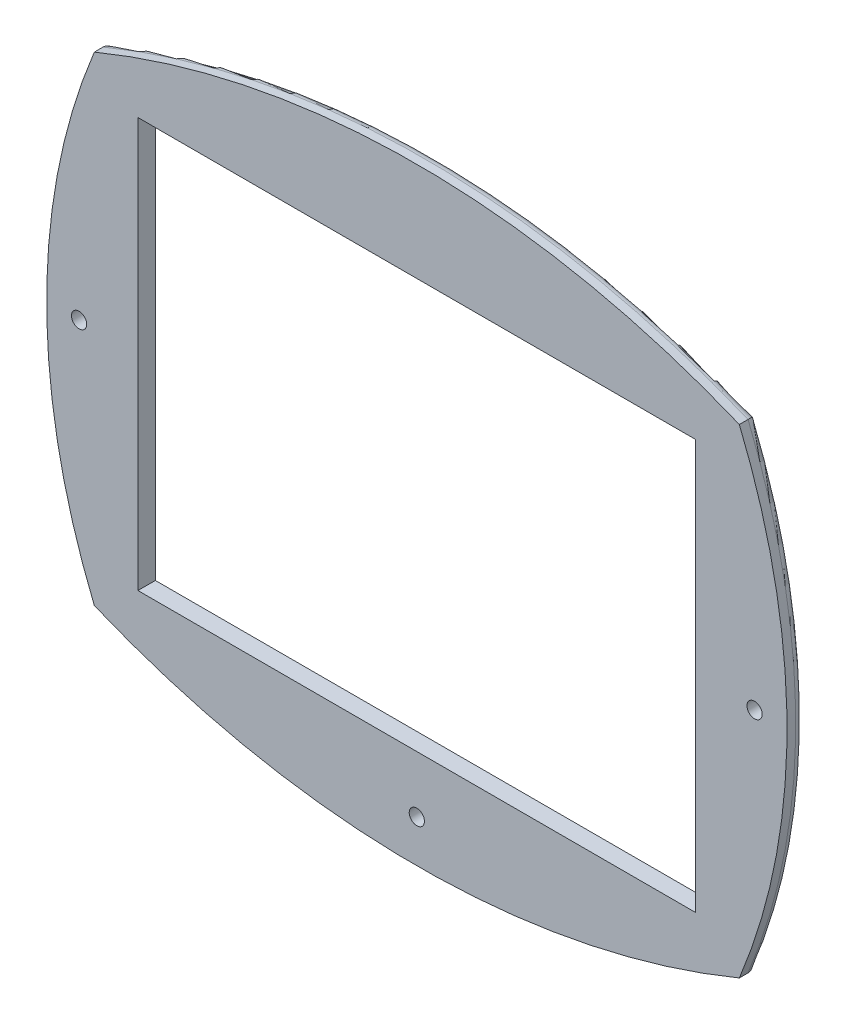
ISO-10303-21;
HEADER;
FILE_DESCRIPTION(('STEP AP214'),'2;1');
FILE_NAME('part.step','',(''),(''),'','','');
FILE_SCHEMA(('AUTOMOTIVE_DESIGN { 1 0 10303 214 1 1 1 1 }'));
ENDSEC;
DATA;
#1=APPLICATION_CONTEXT('core data for automotive mechanical design processes');
#2=APPLICATION_PROTOCOL_DEFINITION('international standard','automotive_design',2000,#1);
#3=PRODUCT_CONTEXT('',#1,'mechanical');
#4=PRODUCT('Part','Part','',(#3));
#5=PRODUCT_RELATED_PRODUCT_CATEGORY('part','',(#4));
#6=PRODUCT_DEFINITION_FORMATION('','',#4);
#7=PRODUCT_DEFINITION_CONTEXT('part definition',#1,'design');
#8=PRODUCT_DEFINITION('design','',#6,#7);
#9=PRODUCT_DEFINITION_SHAPE('','',#8);
#10=(LENGTH_UNIT() NAMED_UNIT(*) SI_UNIT(.MILLI.,.METRE.));
#11=(NAMED_UNIT(*) PLANE_ANGLE_UNIT() SI_UNIT($,.RADIAN.));
#12=(NAMED_UNIT(*) SI_UNIT($,.STERADIAN.) SOLID_ANGLE_UNIT());
#13=UNCERTAINTY_MEASURE_WITH_UNIT(LENGTH_MEASURE(1.E-05),#10,'distance_accuracy_value','');
#14=(GEOMETRIC_REPRESENTATION_CONTEXT(3) GLOBAL_UNCERTAINTY_ASSIGNED_CONTEXT((#13)) GLOBAL_UNIT_ASSIGNED_CONTEXT((#10,
#11,#12)) REPRESENTATION_CONTEXT('',''));
#15=CARTESIAN_POINT('',(0.,0.,0.));
#16=DIRECTION('',(0.,0.,1.));
#17=DIRECTION('',(1.,0.,0.));
#18=AXIS2_PLACEMENT_3D('',#15,#16,#17);
#19=CARTESIAN_POINT('',(-29.3908729652599,0.,2.));
#20=DIRECTION('',(0.,0.,-1.));
#21=DIRECTION('',(-1.,0.,0.));
#22=AXIS2_PLACEMENT_3D('',#19,#20,#21);
#23=CYLINDRICAL_SURFACE('',#22,71.8609630682005);
#24=DIRECTION('',(0.,0.,-1.));
#25=VECTOR('',#24,1.);
#26=CARTESIAN_POINT('',(36.9999999999999,-27.5,2.));
#27=LINE('',#26,#25);
#28=CARTESIAN_POINT('',(36.9999999999999,-27.5,2.));
#29=VERTEX_POINT('',#28);
#30=CARTESIAN_POINT('',(36.9999999999999,-27.5,1.));
#31=VERTEX_POINT('',#30);
#32=EDGE_CURVE('E143',#29,#31,#27,.T.);
#33=ORIENTED_EDGE('',*,*,#32,.T.);
#34=CARTESIAN_POINT('',(-29.3908729652599,0.,1.));
#35=DIRECTION('',(0.,0.,1.));
#36=DIRECTION('',(1.,0.,0.));
#37=AXIS2_PLACEMENT_3D('',#34,#35,#36);
#38=CIRCLE('',#37,71.8609630682005);
#39=CARTESIAN_POINT('',(37.,27.5,1.));
#40=VERTEX_POINT('',#39);
#41=EDGE_CURVE('E47',#31,#40,#38,.T.);
#42=ORIENTED_EDGE('',*,*,#41,.T.);
#43=DIRECTION('',(0.,0.,-1.));
#44=VECTOR('',#43,1.);
#45=CARTESIAN_POINT('',(37.,27.5,2.));
#46=LINE('',#45,#44);
#47=CARTESIAN_POINT('',(37.,27.5,2.));
#48=VERTEX_POINT('',#47);
#49=EDGE_CURVE('E155',#48,#40,#46,.T.);
#50=ORIENTED_EDGE('',*,*,#49,.F.);
#51=CARTESIAN_POINT('',(-29.3908729652599,0.,2.));
#52=DIRECTION('',(0.,0.,1.));
#53=DIRECTION('',(1.,0.,0.));
#54=AXIS2_PLACEMENT_3D('',#51,#52,#53);
#55=CIRCLE('',#54,71.8609630682005);
#56=EDGE_CURVE('E273',#48,#29,#55,.F.);
#57=ORIENTED_EDGE('',*,*,#56,.T.);
#58=EDGE_LOOP('',(#33,#42,#50,#57));
#59=FACE_BOUND('',#58,.T.);
#60=ADVANCED_FACE('F34',(#59),#23,.T.);
#61=CARTESIAN_POINT('',(0.,-61.8259018078043,2.));
#62=DIRECTION('',(0.,0.,-1.));
#63=DIRECTION('',(-1.,0.,0.));
#64=AXIS2_PLACEMENT_3D('',#61,#62,#63);
#65=CYLINDRICAL_SURFACE('',#64,96.6856594008517);
#66=ORIENTED_EDGE('',*,*,#49,.T.);
#67=CARTESIAN_POINT('',(0.,-61.8259018078043,1.));
#68=DIRECTION('',(0.,0.,1.));
#69=DIRECTION('',(1.,0.,0.));
#70=AXIS2_PLACEMENT_3D('',#67,#68,#69);
#71=CIRCLE('',#70,96.6856594008517);
#72=CARTESIAN_POINT('',(-37.,27.5,1.));
#73=VERTEX_POINT('',#72);
#74=EDGE_CURVE('E11',#40,#73,#71,.T.);
#75=ORIENTED_EDGE('',*,*,#74,.T.);
#76=DIRECTION('',(0.,0.,-1.));
#77=VECTOR('',#76,1.);
#78=CARTESIAN_POINT('',(-37.,27.5,2.));
#79=LINE('',#78,#77);
#80=CARTESIAN_POINT('',(-37.,27.5,2.));
#81=VERTEX_POINT('',#80);
#82=EDGE_CURVE('E294',#81,#73,#79,.T.);
#83=ORIENTED_EDGE('',*,*,#82,.F.);
#84=CARTESIAN_POINT('',(0.,-61.8259018078043,2.));
#85=DIRECTION('',(0.,0.,1.));
#86=DIRECTION('',(1.,0.,0.));
#87=AXIS2_PLACEMENT_3D('',#84,#85,#86);
#88=CIRCLE('',#87,96.6856594008517);
#89=EDGE_CURVE('E276',#81,#48,#88,.F.);
#90=ORIENTED_EDGE('',*,*,#89,.T.);
#91=EDGE_LOOP('',(#66,#75,#83,#90));
#92=FACE_BOUND('',#91,.T.);
#93=ADVANCED_FACE('F201',(#92),#65,.T.);
#94=CARTESIAN_POINT('',(29.3908729652599,0.,2.));
#95=DIRECTION('',(0.,0.,-1.));
#96=DIRECTION('',(-1.,0.,0.));
#97=AXIS2_PLACEMENT_3D('',#94,#95,#96);
#98=CYLINDRICAL_SURFACE('',#97,71.8609630682006);
#99=ORIENTED_EDGE('',*,*,#82,.T.);
#100=CARTESIAN_POINT('',(29.3908729652599,0.,1.));
#101=DIRECTION('',(0.,0.,1.));
#102=DIRECTION('',(1.,0.,0.));
#103=AXIS2_PLACEMENT_3D('',#100,#101,#102);
#104=CIRCLE('',#103,71.8609630682006);
#105=CARTESIAN_POINT('',(-37.,-27.5,1.));
#106=VERTEX_POINT('',#105);
#107=EDGE_CURVE('E151',#73,#106,#104,.T.);
#108=ORIENTED_EDGE('',*,*,#107,.T.);
#109=DIRECTION('',(0.,0.,-1.));
#110=VECTOR('',#109,1.);
#111=CARTESIAN_POINT('',(-37.,-27.5,2.));
#112=LINE('',#111,#110);
#113=CARTESIAN_POINT('',(-37.,-27.5,2.));
#114=VERTEX_POINT('',#113);
#115=EDGE_CURVE('E145',#114,#106,#112,.T.);
#116=ORIENTED_EDGE('',*,*,#115,.F.);
#117=CARTESIAN_POINT('',(29.3908729652599,0.,2.));
#118=DIRECTION('',(0.,0.,1.));
#119=DIRECTION('',(1.,0.,0.));
#120=AXIS2_PLACEMENT_3D('',#117,#118,#119);
#121=CIRCLE('',#120,71.8609630682006);
#122=EDGE_CURVE('E279',#81,#114,#121,.T.);
#123=ORIENTED_EDGE('',*,*,#122,.F.);
#124=EDGE_LOOP('',(#99,#108,#116,#123));
#125=FACE_BOUND('',#124,.T.);
#126=ADVANCED_FACE('F206',(#125),#98,.T.);
#127=CARTESIAN_POINT('',(0.,23.5,2.));
#128=DIRECTION('',(0.,1.,0.));
#129=DIRECTION('',(0.,0.,1.));
#130=AXIS2_PLACEMENT_3D('',#127,#128,#129);
#131=PLANE('',#130);
#132=DIRECTION('',(1.,0.,0.));
#133=VECTOR('',#132,1.);
#134=CARTESIAN_POINT('',(0.,23.5,0.));
#135=LINE('',#134,#133);
#136=CARTESIAN_POINT('',(-32.,23.5,0.));
#137=VERTEX_POINT('',#136);
#138=CARTESIAN_POINT('',(32.,23.5,0.));
#139=VERTEX_POINT('',#138);
#140=EDGE_CURVE('E142',#137,#139,#135,.T.);
#141=ORIENTED_EDGE('',*,*,#140,.T.);
#142=DIRECTION('',(0.,0.,-1.));
#143=VECTOR('',#142,1.);
#144=CARTESIAN_POINT('',(32.,23.5,2.));
#145=LINE('',#144,#143);
#146=CARTESIAN_POINT('',(32.,23.5,2.));
#147=VERTEX_POINT('',#146);
#148=EDGE_CURVE('E122',#147,#139,#145,.T.);
#149=ORIENTED_EDGE('',*,*,#148,.F.);
#150=DIRECTION('',(1.,0.,0.));
#151=VECTOR('',#150,1.);
#152=CARTESIAN_POINT('',(0.,23.5,2.));
#153=LINE('',#152,#151);
#154=CARTESIAN_POINT('',(-32.,23.5,2.));
#155=VERTEX_POINT('',#154);
#156=EDGE_CURVE('E129',#155,#147,#153,.T.);
#157=ORIENTED_EDGE('',*,*,#156,.F.);
#158=DIRECTION('',(0.,0.,-1.));
#159=VECTOR('',#158,1.);
#160=CARTESIAN_POINT('',(-32.,23.5,2.));
#161=LINE('',#160,#159);
#162=EDGE_CURVE('E284',#155,#137,#161,.T.);
#163=ORIENTED_EDGE('',*,*,#162,.T.);
#164=EDGE_LOOP('',(#141,#149,#157,#163));
#165=FACE_BOUND('',#164,.T.);
#166=ADVANCED_FACE('F140',(#165),#131,.F.);
#167=CARTESIAN_POINT('',(32.,0.,2.));
#168=DIRECTION('',(1.,0.,0.));
#169=DIRECTION('',(0.,1.,0.));
#170=AXIS2_PLACEMENT_3D('',#167,#168,#169);
#171=PLANE('',#170);
#172=DIRECTION('',(0.,-1.,0.));
#173=VECTOR('',#172,1.);
#174=CARTESIAN_POINT('',(32.,0.,0.));
#175=LINE('',#174,#173);
#176=CARTESIAN_POINT('',(32.,-23.5,0.));
#177=VERTEX_POINT('',#176);
#178=EDGE_CURVE('E286',#139,#177,#175,.T.);
#179=ORIENTED_EDGE('',*,*,#178,.T.);
#180=DIRECTION('',(0.,0.,-1.));
#181=VECTOR('',#180,1.);
#182=CARTESIAN_POINT('',(32.,-23.5,2.));
#183=LINE('',#182,#181);
#184=CARTESIAN_POINT('',(32.,-23.5,2.));
#185=VERTEX_POINT('',#184);
#186=EDGE_CURVE('E124',#185,#177,#183,.T.);
#187=ORIENTED_EDGE('',*,*,#186,.F.);
#188=DIRECTION('',(0.,-1.,0.));
#189=VECTOR('',#188,1.);
#190=CARTESIAN_POINT('',(32.,0.,2.));
#191=LINE('',#190,#189);
#192=EDGE_CURVE('E117',#147,#185,#191,.T.);
#193=ORIENTED_EDGE('',*,*,#192,.F.);
#194=ORIENTED_EDGE('',*,*,#148,.T.);
#195=EDGE_LOOP('',(#179,#187,#193,#194));
#196=FACE_BOUND('',#195,.T.);
#197=ADVANCED_FACE('F120',(#196),#171,.F.);
#198=CARTESIAN_POINT('',(0.,-23.5,2.));
#199=DIRECTION('',(0.,1.,0.));
#200=DIRECTION('',(0.,0.,1.));
#201=AXIS2_PLACEMENT_3D('',#198,#199,#200);
#202=PLANE('',#201);
#203=DIRECTION('',(1.,0.,0.));
#204=VECTOR('',#203,1.);
#205=CARTESIAN_POINT('',(0.,-23.5,0.));
#206=LINE('',#205,#204);
#207=CARTESIAN_POINT('',(-32.,-23.5,0.));
#208=VERTEX_POINT('',#207);
#209=EDGE_CURVE('E288',#208,#177,#206,.T.);
#210=ORIENTED_EDGE('',*,*,#209,.F.);
#211=DIRECTION('',(0.,0.,-1.));
#212=VECTOR('',#211,1.);
#213=CARTESIAN_POINT('',(-32.,-23.5,2.));
#214=LINE('',#213,#212);
#215=CARTESIAN_POINT('',(-32.,-23.5,2.));
#216=VERTEX_POINT('',#215);
#217=EDGE_CURVE('E147',#216,#208,#214,.T.);
#218=ORIENTED_EDGE('',*,*,#217,.F.);
#219=DIRECTION('',(1.,0.,0.));
#220=VECTOR('',#219,1.);
#221=CARTESIAN_POINT('',(0.,-23.5,2.));
#222=LINE('',#221,#220);
#223=EDGE_CURVE('E128',#216,#185,#222,.T.);
#224=ORIENTED_EDGE('',*,*,#223,.T.);
#225=ORIENTED_EDGE('',*,*,#186,.T.);
#226=EDGE_LOOP('',(#210,#218,#224,#225));
#227=FACE_BOUND('',#226,.T.);
#228=ADVANCED_FACE('F215',(#227),#202,.T.);
#229=CARTESIAN_POINT('',(-32.,0.,2.));
#230=DIRECTION('',(1.,0.,0.));
#231=DIRECTION('',(0.,1.,0.));
#232=AXIS2_PLACEMENT_3D('',#229,#230,#231);
#233=PLANE('',#232);
#234=DIRECTION('',(0.,-1.,0.));
#235=VECTOR('',#234,1.);
#236=CARTESIAN_POINT('',(-32.,0.,0.));
#237=LINE('',#236,#235);
#238=EDGE_CURVE('E138',#137,#208,#237,.T.);
#239=ORIENTED_EDGE('',*,*,#238,.F.);
#240=ORIENTED_EDGE('',*,*,#162,.F.);
#241=DIRECTION('',(0.,-1.,0.));
#242=VECTOR('',#241,1.);
#243=CARTESIAN_POINT('',(-32.,0.,2.));
#244=LINE('',#243,#242);
#245=EDGE_CURVE('E136',#155,#216,#244,.T.);
#246=ORIENTED_EDGE('',*,*,#245,.T.);
#247=ORIENTED_EDGE('',*,*,#217,.T.);
#248=EDGE_LOOP('',(#239,#240,#246,#247));
#249=FACE_BOUND('',#248,.T.);
#250=ADVANCED_FACE('F211',(#249),#233,.T.);
#251=CARTESIAN_POINT('',(0.,61.8259018078043,2.));
#252=DIRECTION('',(0.,0.,-1.));
#253=DIRECTION('',(-1.,0.,0.));
#254=AXIS2_PLACEMENT_3D('',#251,#252,#253);
#255=CYLINDRICAL_SURFACE('',#254,96.6856594008516);
#256=ORIENTED_EDGE('',*,*,#115,.T.);
#257=CARTESIAN_POINT('',(0.,61.8259018078043,1.));
#258=DIRECTION('',(0.,0.,1.));
#259=DIRECTION('',(1.,0.,0.));
#260=AXIS2_PLACEMENT_3D('',#257,#258,#259);
#261=CIRCLE('',#260,96.6856594008516);
#262=EDGE_CURVE('E62',#106,#31,#261,.T.);
#263=ORIENTED_EDGE('',*,*,#262,.T.);
#264=ORIENTED_EDGE('',*,*,#32,.F.);
#265=CARTESIAN_POINT('',(0.,61.8259018078043,2.));
#266=DIRECTION('',(0.,0.,1.));
#267=DIRECTION('',(1.,0.,0.));
#268=AXIS2_PLACEMENT_3D('',#265,#266,#267);
#269=CIRCLE('',#268,96.6856594008516);
#270=EDGE_CURVE('E282',#114,#29,#269,.T.);
#271=ORIENTED_EDGE('',*,*,#270,.F.);
#272=EDGE_LOOP('',(#256,#263,#264,#271));
#273=FACE_BOUND('',#272,.T.);
#274=ADVANCED_FACE('F214',(#273),#255,.T.);
#275=CARTESIAN_POINT('',(0.,0.,2.));
#276=DIRECTION('',(0.,0.,1.));
#277=DIRECTION('',(1.,0.,0.));
#278=AXIS2_PLACEMENT_3D('',#275,#276,#277);
#279=PLANE('',#278);
#280=CARTESIAN_POINT('',(-38.75,0.,2.));
#281=DIRECTION('',(0.,0.,-1.));
#282=DIRECTION('',(-1.,0.,0.));
#283=AXIS2_PLACEMENT_3D('',#280,#281,#282);
#284=CIRCLE('',#283,0.874999999999998);
#285=CARTESIAN_POINT('',(-39.625,0.,2.));
#286=VERTEX_POINT('',#285);
#287=EDGE_CURVE('E253',#286,#286,#284,.T.);
#288=ORIENTED_EDGE('',*,*,#287,.T.);
#289=EDGE_LOOP('',(#288));
#290=FACE_BOUND('',#289,.T.);
#291=CARTESIAN_POINT('',(0.,-30.,2.));
#292=DIRECTION('',(0.,0.,-1.));
#293=DIRECTION('',(-1.,0.,0.));
#294=AXIS2_PLACEMENT_3D('',#291,#292,#293);
#295=CIRCLE('',#294,0.875);
#296=CARTESIAN_POINT('',(-0.875,-30.,2.));
#297=VERTEX_POINT('',#296);
#298=EDGE_CURVE('E261',#297,#297,#295,.T.);
#299=ORIENTED_EDGE('',*,*,#298,.T.);
#300=EDGE_LOOP('',(#299));
#301=FACE_BOUND('',#300,.T.);
#302=CARTESIAN_POINT('',(38.75,0.,2.));
#303=DIRECTION('',(0.,0.,-1.));
#304=DIRECTION('',(-1.,0.,0.));
#305=AXIS2_PLACEMENT_3D('',#302,#303,#304);
#306=CIRCLE('',#305,0.874999999999998);
#307=CARTESIAN_POINT('',(37.875,0.,2.));
#308=VERTEX_POINT('',#307);
#309=EDGE_CURVE('E174',#308,#308,#306,.T.);
#310=ORIENTED_EDGE('',*,*,#309,.T.);
#311=EDGE_LOOP('',(#310));
#312=FACE_BOUND('',#311,.T.);
#313=ORIENTED_EDGE('',*,*,#156,.T.);
#314=ORIENTED_EDGE('',*,*,#192,.T.);
#315=ORIENTED_EDGE('',*,*,#223,.F.);
#316=ORIENTED_EDGE('',*,*,#245,.F.);
#317=EDGE_LOOP('',(#313,#314,#315,#316));
#318=FACE_BOUND('',#317,.T.);
#319=ORIENTED_EDGE('',*,*,#56,.F.);
#320=ORIENTED_EDGE('',*,*,#89,.F.);
#321=ORIENTED_EDGE('',*,*,#122,.T.);
#322=ORIENTED_EDGE('',*,*,#270,.T.);
#323=EDGE_LOOP('',(#319,#320,#321,#322));
#324=FACE_BOUND('',#323,.T.);
#325=ADVANCED_FACE('F133',(#290,#301,#312,#318,#324),#279,.T.);
#326=CARTESIAN_POINT('',(0.,0.,0.));
#327=DIRECTION('',(0.,0.,1.));
#328=DIRECTION('',(1.,0.,0.));
#329=AXIS2_PLACEMENT_3D('',#326,#327,#328);
#330=PLANE('',#329);
#331=CARTESIAN_POINT('',(-38.75,0.,0.));
#332=DIRECTION('',(0.,0.,-1.));
#333=DIRECTION('',(-1.,0.,0.));
#334=AXIS2_PLACEMENT_3D('',#331,#332,#333);
#335=CIRCLE('',#334,0.874999999999998);
#336=CARTESIAN_POINT('',(-39.625,0.,0.));
#337=VERTEX_POINT('',#336);
#338=EDGE_CURVE('E256',#337,#337,#335,.T.);
#339=ORIENTED_EDGE('',*,*,#338,.F.);
#340=EDGE_LOOP('',(#339));
#341=FACE_BOUND('',#340,.T.);
#342=CARTESIAN_POINT('',(0.,-30.,0.));
#343=DIRECTION('',(0.,0.,-1.));
#344=DIRECTION('',(-1.,0.,0.));
#345=AXIS2_PLACEMENT_3D('',#342,#343,#344);
#346=CIRCLE('',#345,0.875);
#347=CARTESIAN_POINT('',(-0.875,-30.,0.));
#348=VERTEX_POINT('',#347);
#349=EDGE_CURVE('E258',#348,#348,#346,.T.);
#350=ORIENTED_EDGE('',*,*,#349,.F.);
#351=EDGE_LOOP('',(#350));
#352=FACE_BOUND('',#351,.T.);
#353=CARTESIAN_POINT('',(38.75,0.,0.));
#354=DIRECTION('',(0.,0.,-1.));
#355=DIRECTION('',(-1.,0.,0.));
#356=AXIS2_PLACEMENT_3D('',#353,#354,#355);
#357=CIRCLE('',#356,0.874999999999998);
#358=CARTESIAN_POINT('',(37.875,0.,0.));
#359=VERTEX_POINT('',#358);
#360=EDGE_CURVE('E264',#359,#359,#357,.T.);
#361=ORIENTED_EDGE('',*,*,#360,.F.);
#362=EDGE_LOOP('',(#361));
#363=FACE_BOUND('',#362,.T.);
#364=CARTESIAN_POINT('',(0.,61.8259018078043,0.));
#365=DIRECTION('',(0.,0.,1.));
#366=DIRECTION('',(1.,0.,0.));
#367=AXIS2_PLACEMENT_3D('',#364,#365,#366);
#368=CIRCLE('',#367,95.6856594008516);
#369=CARTESIAN_POINT('',(36.2335379982626,-26.7341125276973,0.));
#370=VERTEX_POINT('',#369);
#371=CARTESIAN_POINT('',(-36.2335379982627,-26.7341125276973,0.));
#372=VERTEX_POINT('',#371);
#373=EDGE_CURVE('E159',#370,#372,#368,.F.);
#374=ORIENTED_EDGE('',*,*,#373,.T.);
#375=CARTESIAN_POINT('',(29.3908729652599,0.,0.));
#376=DIRECTION('',(0.,0.,1.));
#377=DIRECTION('',(1.,0.,0.));
#378=AXIS2_PLACEMENT_3D('',#375,#376,#377);
#379=CIRCLE('',#378,70.8609630682006);
#380=CARTESIAN_POINT('',(-36.2335379982626,26.7341125276973,0.));
#381=VERTEX_POINT('',#380);
#382=EDGE_CURVE('E161',#372,#381,#379,.F.);
#383=ORIENTED_EDGE('',*,*,#382,.T.);
#384=CARTESIAN_POINT('',(0.,-61.8259018078043,0.));
#385=DIRECTION('',(0.,0.,1.));
#386=DIRECTION('',(1.,0.,0.));
#387=AXIS2_PLACEMENT_3D('',#384,#385,#386);
#388=CIRCLE('',#387,95.6856594008517);
#389=CARTESIAN_POINT('',(36.2335379982626,26.7341125276973,0.));
#390=VERTEX_POINT('',#389);
#391=EDGE_CURVE('E154',#381,#390,#388,.F.);
#392=ORIENTED_EDGE('',*,*,#391,.T.);
#393=CARTESIAN_POINT('',(-29.3908729652599,0.,0.));
#394=DIRECTION('',(0.,0.,1.));
#395=DIRECTION('',(1.,0.,0.));
#396=AXIS2_PLACEMENT_3D('',#393,#394,#395);
#397=CIRCLE('',#396,70.8609630682005);
#398=EDGE_CURVE('E157',#390,#370,#397,.F.);
#399=ORIENTED_EDGE('',*,*,#398,.T.);
#400=EDGE_LOOP('',(#374,#383,#392,#399));
#401=FACE_BOUND('',#400,.T.);
#402=ORIENTED_EDGE('',*,*,#140,.F.);
#403=ORIENTED_EDGE('',*,*,#238,.T.);
#404=ORIENTED_EDGE('',*,*,#209,.T.);
#405=ORIENTED_EDGE('',*,*,#178,.F.);
#406=EDGE_LOOP('',(#402,#403,#404,#405));
#407=FACE_BOUND('',#406,.T.);
#408=ADVANCED_FACE('F197',(#341,#352,#363,#401,#407),#330,.F.);
#409=CARTESIAN_POINT('',(-29.3908729652599,0.,1.));
#410=DIRECTION('',(0.,0.,1.));
#411=DIRECTION('',(1.,0.,0.));
#412=AXIS2_PLACEMENT_3D('',#409,#410,#411);
#413=TOROIDAL_SURFACE('',#412,70.8609630682005,1.);
#414=CARTESIAN_POINT('',(36.9999999999999,-27.5,1.));
#415=CARTESIAN_POINT('',(37.0000006454729,-27.5000006517377,0.9734140534353));
#416=CARTESIAN_POINT('',(36.9991879715394,-27.4991879709086,0.946841431281818));
#417=CARTESIAN_POINT('',(36.9959511433835,-27.4959511554365,0.89389852892022));
#418=CARTESIAN_POINT('',(36.9935273146641,-27.4935273462913,0.867528208929138));
#419=CARTESIAN_POINT('',(36.9838846586652,-27.4838848674329,0.789157604832926));
#420=CARTESIAN_POINT('',(36.9742944073282,-27.4742948913634,0.737702750726048));
#421=CARTESIAN_POINT('',(36.9491737207126,-27.4491760697353,0.637838057785487));
#422=CARTESIAN_POINT('',(36.9336448629545,-27.4336488013482,0.589427414266572));
#423=CARTESIAN_POINT('',(36.8972250142863,-27.3972349214859,0.49680995740899));
#424=CARTESIAN_POINT('',(36.8763320213308,-27.3763463090078,0.452604722107335));
#425=CARTESIAN_POINT('',(36.829173576208,-27.3292013058199,0.368109779698057));
#426=CARTESIAN_POINT('',(36.8027616582633,-27.302798590231,0.327983931453884));
#427=CARTESIAN_POINT('',(36.7458320880646,-27.2458939930585,0.254054363943943));
#428=CARTESIAN_POINT('',(36.7153131292371,-27.2153908069952,0.220252664793814));
#429=CARTESIAN_POINT('',(36.6487024678975,-27.1488212483041,0.157341582201635));
#430=CARTESIAN_POINT('',(36.6123675196812,-27.1125122376759,0.128747055956251));
#431=CARTESIAN_POINT('',(36.5369768041409,-27.0371841223175,0.0799144107795119));
#432=CARTESIAN_POINT('',(36.4979200433044,-26.9981640280067,0.05967936208369));
#433=CARTESIAN_POINT('',(36.4223677164697,-26.9226918435645,0.0295346193055102));
#434=CARTESIAN_POINT('',(36.3860437753347,-26.8864102336682,0.0187533263601759));
#435=CARTESIAN_POINT('',(36.312747856409,-26.8132078911422,0.00417115700707229));
#436=CARTESIAN_POINT('',(36.2757773344348,-26.7762885961664,0.000356236665000513));
#437=CARTESIAN_POINT('',(36.2370682791797,-26.7376374949193,7.91473840324419E-06));
#438=CARTESIAN_POINT('',(36.2353030871475,-26.7358749550942,-1.88588959210333E-08));
#439=CARTESIAN_POINT('',(36.2335379982626,-26.7341125276973,0.));
#440=B_SPLINE_CURVE_WITH_KNOTS('',3,(#414,#415,#416,#417,#418,#419,#420,#421,#422,#423,#424,
#425,#426,#427,#428,#429,#430,#431,#432,#433,#434,#435,#436,#437,#438,#439),.UNSPECIFIED.,.F.,
.F.,(4,2,2,2,2,2,2,2,2,2,2,2,4),(0.,0.0797068473752799,0.159397596395946,0.318202053349221,
0.476964355047411,0.635785997639765,0.799531021873472,0.963328262022708,1.13894942403484,
1.3146350302649,1.47156745540758,1.62818316017986,1.63566658992668),.UNSPECIFIED.);
#441=EDGE_CURVE('E308',#370,#31,#440,.F.);
#442=ORIENTED_EDGE('',*,*,#441,.F.);
#443=ORIENTED_EDGE('',*,*,#398,.F.);
#444=CARTESIAN_POINT('',(37.,27.5,1.));
#445=CARTESIAN_POINT('',(37.0000006454729,27.5000006517377,0.9734140534353));
#446=CARTESIAN_POINT('',(36.9991879715394,27.4991879709086,0.946841431281819));
#447=CARTESIAN_POINT('',(36.9959511433835,27.4959511554365,0.893898528920222));
#448=CARTESIAN_POINT('',(36.9935273146641,27.4935273462913,0.867528208929139));
#449=CARTESIAN_POINT('',(36.9838846586652,27.4838848674329,0.789157604832926));
#450=CARTESIAN_POINT('',(36.9742944073282,27.4742948913634,0.737702750726046));
#451=CARTESIAN_POINT('',(36.9491737207126,27.4491760697354,0.637838057785486));
#452=CARTESIAN_POINT('',(36.9336448629545,27.4336488013482,0.589427414266573));
#453=CARTESIAN_POINT('',(36.8972250142863,27.3972349214859,0.496809957408991));
#454=CARTESIAN_POINT('',(36.8763320213308,27.3763463090078,0.452604722107335));
#455=CARTESIAN_POINT('',(36.829173576208,27.3292013058199,0.368109779698059));
#456=CARTESIAN_POINT('',(36.8027616582633,27.302798590231,0.32798393145389));
#457=CARTESIAN_POINT('',(36.7458320880646,27.2458939930585,0.25405436394395));
#458=CARTESIAN_POINT('',(36.7153131292371,27.2153908069952,0.220252664793819));
#459=CARTESIAN_POINT('',(36.6487024678975,27.1488212483041,0.157341582201634));
#460=CARTESIAN_POINT('',(36.6123675196812,27.1125122376759,0.128747055956247));
#461=CARTESIAN_POINT('',(36.5369768041409,27.0371841223174,0.0799144107795054));
#462=CARTESIAN_POINT('',(36.4979200433044,26.9981640280067,0.0596793620836843));
#463=CARTESIAN_POINT('',(36.4223677164697,26.9226918435645,0.0295346193055072));
#464=CARTESIAN_POINT('',(36.3860437753347,26.8864102336682,0.0187533263601742));
#465=CARTESIAN_POINT('',(36.312747856409,26.8132078911422,0.00417115700707158));
#466=CARTESIAN_POINT('',(36.2757773344348,26.7762885961664,0.000356236664999347));
#467=CARTESIAN_POINT('',(36.2370682791797,26.7376374949193,7.91473840312529E-06));
#468=CARTESIAN_POINT('',(36.2353030871475,26.7358749550943,-1.8858895988277E-08));
#469=CARTESIAN_POINT('',(36.2335379982626,26.7341125276973,0.));
#470=B_SPLINE_CURVE_WITH_KNOTS('',3,(#444,#445,#446,#447,#448,#449,#450,#451,#452,#453,#454,
#455,#456,#457,#458,#459,#460,#461,#462,#463,#464,#465,#466,#467,#468,#469),.UNSPECIFIED.,.F.,
.F.,(4,2,2,2,2,2,2,2,2,2,2,2,4),(0.,0.0797068473752787,0.159397596395946,0.318202053349222,
0.47696435504741,0.635785997639768,0.79953102187347,0.963328262022713,1.13894942403485,
1.31463503026491,1.47156745540759,1.62818316017985,1.63566658992667),.UNSPECIFIED.);
#471=EDGE_CURVE('E39',#40,#390,#470,.T.);
#472=ORIENTED_EDGE('',*,*,#471,.F.);
#473=ORIENTED_EDGE('',*,*,#41,.F.);
#474=EDGE_LOOP('',(#442,#443,#472,#473));
#475=FACE_BOUND('',#474,.T.);
#476=ADVANCED_FACE('F36',(#475),#413,.T.);
#477=CARTESIAN_POINT('',(0.,-61.8259018078043,1.));
#478=DIRECTION('',(0.,0.,1.));
#479=DIRECTION('',(1.,0.,0.));
#480=AXIS2_PLACEMENT_3D('',#477,#478,#479);
#481=TOROIDAL_SURFACE('',#480,95.6856594008517,1.);
#482=ORIENTED_EDGE('',*,*,#471,.T.);
#483=ORIENTED_EDGE('',*,*,#391,.F.);
#484=CARTESIAN_POINT('',(-37.,27.5,1.));
#485=CARTESIAN_POINT('',(-37.0000006454729,27.5000006517378,0.9734140534353));
#486=CARTESIAN_POINT('',(-36.9991879715394,27.4991879709086,0.946841431281819));
#487=CARTESIAN_POINT('',(-36.9959511433835,27.4959511554365,0.893898528920222));
#488=CARTESIAN_POINT('',(-36.9935273146642,27.4935273462913,0.86752820892914));
#489=CARTESIAN_POINT('',(-36.9838846586653,27.4838848674328,0.789157604832927));
#490=CARTESIAN_POINT('',(-36.9742944073283,27.4742948913634,0.737702750726047));
#491=CARTESIAN_POINT('',(-36.9491737207126,27.4491760697353,0.637838057785485));
#492=CARTESIAN_POINT('',(-36.9336448629545,27.4336488013482,0.589427414266569));
#493=CARTESIAN_POINT('',(-36.8972250142864,27.3972349214859,0.496809957408991));
#494=CARTESIAN_POINT('',(-36.8763320213308,27.3763463090078,0.452604722107339));
#495=CARTESIAN_POINT('',(-36.829173576208,27.3292013058199,0.368109779698058));
#496=CARTESIAN_POINT('',(-36.8027616582634,27.302798590231,0.327983931453877));
#497=CARTESIAN_POINT('',(-36.7458320880646,27.2458939930585,0.254054363943937));
#498=CARTESIAN_POINT('',(-36.7153131292372,27.2153908069952,0.220252664793815));
#499=CARTESIAN_POINT('',(-36.6487024678975,27.1488212483041,0.157341582201639));
#500=CARTESIAN_POINT('',(-36.6123675196812,27.1125122376759,0.12874705595625));
#501=CARTESIAN_POINT('',(-36.5369768041409,27.0371841223175,0.0799144107795071));
#502=CARTESIAN_POINT('',(-36.4979200433045,26.9981640280067,0.0596793620836884));
#503=CARTESIAN_POINT('',(-36.4223677164697,26.9226918435645,0.0295346193055116));
#504=CARTESIAN_POINT('',(-36.3860437753348,26.8864102336682,0.0187533263601768));
#505=CARTESIAN_POINT('',(-36.3127478564091,26.8132078911422,0.00417115700707341));
#506=CARTESIAN_POINT('',(-36.2757773344349,26.7762885961664,0.000356236665002395));
#507=CARTESIAN_POINT('',(-36.2370682791798,26.7376374949193,7.9147384033891E-06));
#508=CARTESIAN_POINT('',(-36.2353030871475,26.7358749550943,-1.88588958595792E-08));
#509=CARTESIAN_POINT('',(-36.2335379982626,26.7341125276973,0.));
#510=B_SPLINE_CURVE_WITH_KNOTS('',3,(#484,#485,#486,#487,#488,#489,#490,#491,#492,#493,#494,
#495,#496,#497,#498,#499,#500,#501,#502,#503,#504,#505,#506,#507,#508,#509),.UNSPECIFIED.,.F.,
.F.,(4,2,2,2,2,2,2,2,2,2,2,2,4),(0.,0.0797068473752787,0.159397596395946,0.31820205334922,
0.476964355047409,0.635785997639769,0.799531021873475,0.963328262022712,1.13894942403484,
1.3146350302649,1.47156745540757,1.62818316017983,1.63566658992666),.UNSPECIFIED.);
#511=EDGE_CURVE('E173',#73,#381,#510,.T.);
#512=ORIENTED_EDGE('',*,*,#511,.F.);
#513=ORIENTED_EDGE('',*,*,#74,.F.);
#514=EDGE_LOOP('',(#482,#483,#512,#513));
#515=FACE_BOUND('',#514,.T.);
#516=ADVANCED_FACE('F186',(#515),#481,.T.);
#517=CARTESIAN_POINT('',(0.,61.8259018078043,1.));
#518=DIRECTION('',(0.,0.,1.));
#519=DIRECTION('',(1.,0.,0.));
#520=AXIS2_PLACEMENT_3D('',#517,#518,#519);
#521=TOROIDAL_SURFACE('',#520,95.6856594008516,1.);
#522=ORIENTED_EDGE('',*,*,#441,.T.);
#523=ORIENTED_EDGE('',*,*,#262,.F.);
#524=CARTESIAN_POINT('',(-37.,-27.5,1.));
#525=CARTESIAN_POINT('',(-37.0000006454729,-27.5000006517377,0.973414053435301));
#526=CARTESIAN_POINT('',(-36.9991879715394,-27.4991879709086,0.946841431281821));
#527=CARTESIAN_POINT('',(-36.9959511433835,-27.4959511554365,0.893898528920223));
#528=CARTESIAN_POINT('',(-36.9935273146642,-27.4935273462912,0.867528208929139));
#529=CARTESIAN_POINT('',(-36.9838846586653,-27.4838848674328,0.789157604832925));
#530=CARTESIAN_POINT('',(-36.9742944073283,-27.4742948913634,0.737702750726043));
#531=CARTESIAN_POINT('',(-36.9491737207126,-27.4491760697353,0.637838057785486));
#532=CARTESIAN_POINT('',(-36.9336448629545,-27.4336488013482,0.589427414266577));
#533=CARTESIAN_POINT('',(-36.8972250142864,-27.3972349214859,0.496809957409));
#534=CARTESIAN_POINT('',(-36.8763320213308,-27.3763463090078,0.452604722107343));
#535=CARTESIAN_POINT('',(-36.829173576208,-27.3292013058199,0.368109779698066));
#536=CARTESIAN_POINT('',(-36.8027616582634,-27.3027985902309,0.327983931453895));
#537=CARTESIAN_POINT('',(-36.7458320880646,-27.2458939930585,0.254054363943956));
#538=CARTESIAN_POINT('',(-36.7153131292372,-27.2153908069952,0.220252664793826));
#539=CARTESIAN_POINT('',(-36.6487024678975,-27.1488212483041,0.157341582201642));
#540=CARTESIAN_POINT('',(-36.6123675196812,-27.1125122376759,0.128747055956254));
#541=CARTESIAN_POINT('',(-36.536976804141,-27.0371841223174,0.0799144107795108));
#542=CARTESIAN_POINT('',(-36.4979200433045,-26.9981640280067,0.0596793620836893));
#543=CARTESIAN_POINT('',(-36.4223677164698,-26.9226918435645,0.0295346193055112));
#544=CARTESIAN_POINT('',(-36.3860437753348,-26.8864102336682,0.0187533263601779));
#545=CARTESIAN_POINT('',(-36.3127478564091,-26.8132078911422,0.00417115700707416));
#546=CARTESIAN_POINT('',(-36.2757773344348,-26.7762885961664,0.000356236665001687));
#547=CARTESIAN_POINT('',(-36.2370682791798,-26.7376374949193,7.91473840332328E-06));
#548=CARTESIAN_POINT('',(-36.2353030871475,-26.7358749550942,-1.88588958916621E-08));
#549=CARTESIAN_POINT('',(-36.2335379982627,-26.7341125276973,0.));
#550=B_SPLINE_CURVE_WITH_KNOTS('',3,(#524,#525,#526,#527,#528,#529,#530,#531,#532,#533,#534,
#535,#536,#537,#538,#539,#540,#541,#542,#543,#544,#545,#546,#547,#548,#549),.UNSPECIFIED.,.F.,
.F.,(4,2,2,2,2,2,2,2,2,2,2,2,4),(0.,0.0797068473752776,0.159397596395946,0.318202053349216,
0.476964355047405,0.635785997639767,0.799531021873466,0.963328262022697,1.13894942403483,
1.31463503026489,1.47156745540757,1.62818316017985,1.63566658992667),.UNSPECIFIED.);
#551=EDGE_CURVE('E166',#372,#106,#550,.F.);
#552=ORIENTED_EDGE('',*,*,#551,.F.);
#553=ORIENTED_EDGE('',*,*,#373,.F.);
#554=EDGE_LOOP('',(#522,#523,#552,#553));
#555=FACE_BOUND('',#554,.T.);
#556=ADVANCED_FACE('F178',(#555),#521,.T.);
#557=CARTESIAN_POINT('',(29.3908729652599,0.,1.));
#558=DIRECTION('',(0.,0.,1.));
#559=DIRECTION('',(1.,0.,0.));
#560=AXIS2_PLACEMENT_3D('',#557,#558,#559);
#561=TOROIDAL_SURFACE('',#560,70.8609630682006,1.);
#562=ORIENTED_EDGE('',*,*,#511,.T.);
#563=ORIENTED_EDGE('',*,*,#382,.F.);
#564=ORIENTED_EDGE('',*,*,#551,.T.);
#565=ORIENTED_EDGE('',*,*,#107,.F.);
#566=EDGE_LOOP('',(#562,#563,#564,#565));
#567=FACE_BOUND('',#566,.T.);
#568=ADVANCED_FACE('F181',(#567),#561,.T.);
#569=CARTESIAN_POINT('',(38.75,0.,2.));
#570=DIRECTION('',(0.,0.,-1.));
#571=DIRECTION('',(-1.,0.,0.));
#572=AXIS2_PLACEMENT_3D('',#569,#570,#571);
#573=CYLINDRICAL_SURFACE('',#572,0.874999999999998);
#574=ORIENTED_EDGE('',*,*,#309,.F.);
#575=EDGE_LOOP('',(#574));
#576=FACE_BOUND('',#575,.T.);
#577=ORIENTED_EDGE('',*,*,#360,.T.);
#578=EDGE_LOOP('',(#577));
#579=FACE_BOUND('',#578,.T.);
#580=ADVANCED_FACE('F184',(#576,#579),#573,.F.);
#581=CARTESIAN_POINT('',(0.,-30.,2.));
#582=DIRECTION('',(0.,0.,-1.));
#583=DIRECTION('',(-1.,0.,0.));
#584=AXIS2_PLACEMENT_3D('',#581,#582,#583);
#585=CYLINDRICAL_SURFACE('',#584,0.875);
#586=ORIENTED_EDGE('',*,*,#298,.F.);
#587=EDGE_LOOP('',(#586));
#588=FACE_BOUND('',#587,.T.);
#589=ORIENTED_EDGE('',*,*,#349,.T.);
#590=EDGE_LOOP('',(#589));
#591=FACE_BOUND('',#590,.T.);
#592=ADVANCED_FACE('F240',(#588,#591),#585,.F.);
#593=CARTESIAN_POINT('',(-38.75,0.,2.));
#594=DIRECTION('',(0.,0.,-1.));
#595=DIRECTION('',(-1.,0.,0.));
#596=AXIS2_PLACEMENT_3D('',#593,#594,#595);
#597=CYLINDRICAL_SURFACE('',#596,0.874999999999998);
#598=ORIENTED_EDGE('',*,*,#287,.F.);
#599=EDGE_LOOP('',(#598));
#600=FACE_BOUND('',#599,.T.);
#601=ORIENTED_EDGE('',*,*,#338,.T.);
#602=EDGE_LOOP('',(#601));
#603=FACE_BOUND('',#602,.T.);
#604=ADVANCED_FACE('F244',(#600,#603),#597,.F.);
#605=CLOSED_SHELL('',(#60,#93,#126,#166,#197,#228,#250,#274,#325,#408,#476,#516,#556,#568,#580,
#592,#604));
#606=MANIFOLD_SOLID_BREP('B2',#605);
#607=ADVANCED_BREP_SHAPE_REPRESENTATION('',(#18,#606),#14);
#608=SHAPE_DEFINITION_REPRESENTATION(#9,#607);
ENDSEC;
END-ISO-10303-21;
